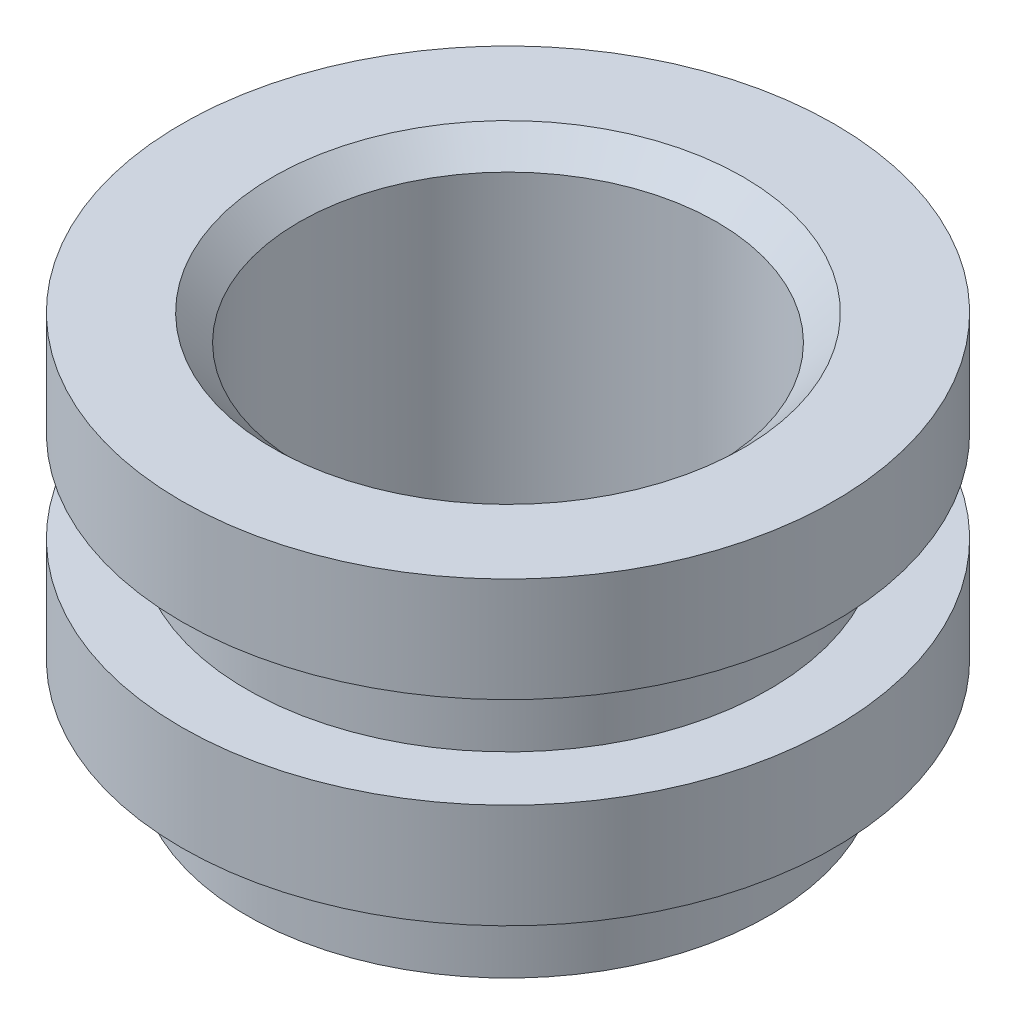
ISO-10303-21;
HEADER;
FILE_DESCRIPTION(('STEP AP214'),'2;1');
FILE_NAME('part.step','',(''),(''),'','','');
FILE_SCHEMA(('AUTOMOTIVE_DESIGN { 1 0 10303 214 1 1 1 1 }'));
ENDSEC;
DATA;
#1=APPLICATION_CONTEXT('core data for automotive mechanical design processes');
#2=APPLICATION_PROTOCOL_DEFINITION('international standard','automotive_design',2000,#1);
#3=PRODUCT_CONTEXT('',#1,'mechanical');
#4=PRODUCT('Part','Part','',(#3));
#5=PRODUCT_RELATED_PRODUCT_CATEGORY('part','',(#4));
#6=PRODUCT_DEFINITION_FORMATION('','',#4);
#7=PRODUCT_DEFINITION_CONTEXT('part definition',#1,'design');
#8=PRODUCT_DEFINITION('design','',#6,#7);
#9=PRODUCT_DEFINITION_SHAPE('','',#8);
#10=(LENGTH_UNIT() NAMED_UNIT(*) SI_UNIT(.MILLI.,.METRE.));
#11=(NAMED_UNIT(*) PLANE_ANGLE_UNIT() SI_UNIT($,.RADIAN.));
#12=(NAMED_UNIT(*) SI_UNIT($,.STERADIAN.) SOLID_ANGLE_UNIT());
#13=UNCERTAINTY_MEASURE_WITH_UNIT(LENGTH_MEASURE(1.E-05),#10,'distance_accuracy_value','');
#14=(GEOMETRIC_REPRESENTATION_CONTEXT(3) GLOBAL_UNCERTAINTY_ASSIGNED_CONTEXT((#13)) GLOBAL_UNIT_ASSIGNED_CONTEXT((#10,
#11,#12)) REPRESENTATION_CONTEXT('',''));
#15=CARTESIAN_POINT('',(0.,0.,0.));
#16=DIRECTION('',(0.,0.,1.));
#17=DIRECTION('',(1.,0.,0.));
#18=AXIS2_PLACEMENT_3D('',#15,#16,#17);
#19=CARTESIAN_POINT('',(-1.,0.20844480004597,0.));
#20=DIRECTION('',(0.,-1.,0.));
#21=DIRECTION('',(0.,0.,-1.));
#22=AXIS2_PLACEMENT_3D('',#19,#20,#21);
#23=PLANE('',#22);
#24=CARTESIAN_POINT('',(0.,0.20844480004597,0.));
#25=DIRECTION('',(0.,-1.,0.));
#26=DIRECTION('',(0.,0.,-1.));
#27=AXIS2_PLACEMENT_3D('',#24,#25,#26);
#28=CIRCLE('',#27,1.25);
#29=CARTESIAN_POINT('',(0.,0.20844480004597,-1.25));
#30=VERTEX_POINT('',#29);
#31=EDGE_CURVE('E55',#30,#30,#28,.T.);
#32=ORIENTED_EDGE('',*,*,#31,.F.);
#33=EDGE_LOOP('',(#32));
#34=FACE_BOUND('',#33,.T.);
#35=CARTESIAN_POINT('',(0.,0.20844480004597,0.));
#36=DIRECTION('',(0.,-1.,0.));
#37=DIRECTION('',(0.,0.,-1.));
#38=AXIS2_PLACEMENT_3D('',#35,#36,#37);
#39=CIRCLE('',#38,1.);
#40=CARTESIAN_POINT('',(0.,0.20844480004597,-1.));
#41=VERTEX_POINT('',#40);
#42=EDGE_CURVE('E76',#41,#41,#39,.T.);
#43=ORIENTED_EDGE('',*,*,#42,.T.);
#44=EDGE_LOOP('',(#43));
#45=FACE_BOUND('',#44,.T.);
#46=ADVANCED_FACE('F35',(#34,#45),#23,.F.);
#47=CARTESIAN_POINT('',(0.,-2.60469314079422,0.));
#48=DIRECTION('',(0.,-1.,0.));
#49=DIRECTION('',(0.,0.,-1.));
#50=AXIS2_PLACEMENT_3D('',#47,#48,#49);
#51=CYLINDRICAL_SURFACE('',#50,1.25);
#52=CARTESIAN_POINT('',(0.,-0.19155519995403,0.));
#53=DIRECTION('',(0.,-1.,0.));
#54=DIRECTION('',(0.,0.,-1.));
#55=AXIS2_PLACEMENT_3D('',#52,#53,#54);
#56=CIRCLE('',#55,1.25);
#57=CARTESIAN_POINT('',(0.,-0.19155519995403,-1.25));
#58=VERTEX_POINT('',#57);
#59=EDGE_CURVE('E58',#58,#58,#56,.T.);
#60=ORIENTED_EDGE('',*,*,#59,.F.);
#61=EDGE_LOOP('',(#60));
#62=FACE_BOUND('',#61,.T.);
#63=ORIENTED_EDGE('',*,*,#31,.T.);
#64=EDGE_LOOP('',(#63));
#65=FACE_BOUND('',#64,.T.);
#66=ADVANCED_FACE('F111',(#62,#65),#51,.T.);
#67=CARTESIAN_POINT('',(-1.25,-0.19155519995403,0.));
#68=DIRECTION('',(0.,1.,0.));
#69=DIRECTION('',(0.,0.,1.));
#70=AXIS2_PLACEMENT_3D('',#67,#68,#69);
#71=PLANE('',#70);
#72=CARTESIAN_POINT('',(0.,-0.19155519995403,0.));
#73=DIRECTION('',(0.,-1.,0.));
#74=DIRECTION('',(0.,0.,-1.));
#75=AXIS2_PLACEMENT_3D('',#72,#73,#74);
#76=CIRCLE('',#75,1.);
#77=CARTESIAN_POINT('',(0.,-0.19155519995403,-1.));
#78=VERTEX_POINT('',#77);
#79=EDGE_CURVE('E61',#78,#78,#76,.T.);
#80=ORIENTED_EDGE('',*,*,#79,.F.);
#81=EDGE_LOOP('',(#80));
#82=FACE_BOUND('',#81,.T.);
#83=ORIENTED_EDGE('',*,*,#59,.T.);
#84=EDGE_LOOP('',(#83));
#85=FACE_BOUND('',#84,.T.);
#86=ADVANCED_FACE('F117',(#82,#85),#71,.F.);
#87=CARTESIAN_POINT('',(0.,-2.60469314079422,0.));
#88=DIRECTION('',(0.,-1.,0.));
#89=DIRECTION('',(0.,0.,-1.));
#90=AXIS2_PLACEMENT_3D('',#87,#88,#89);
#91=CYLINDRICAL_SURFACE('',#90,1.);
#92=CARTESIAN_POINT('',(0.,-0.54155519995403,0.));
#93=DIRECTION('',(0.,-1.,0.));
#94=DIRECTION('',(0.,0.,-1.));
#95=AXIS2_PLACEMENT_3D('',#92,#93,#94);
#96=CIRCLE('',#95,1.);
#97=CARTESIAN_POINT('',(0.,-0.54155519995403,-1.));
#98=VERTEX_POINT('',#97);
#99=EDGE_CURVE('E64',#98,#98,#96,.T.);
#100=ORIENTED_EDGE('',*,*,#99,.F.);
#101=EDGE_LOOP('',(#100));
#102=FACE_BOUND('',#101,.T.);
#103=ORIENTED_EDGE('',*,*,#79,.T.);
#104=EDGE_LOOP('',(#103));
#105=FACE_BOUND('',#104,.T.);
#106=ADVANCED_FACE('F160',(#102,#105),#91,.T.);
#107=CARTESIAN_POINT('',(-0.8,-0.54155519995403,0.));
#108=DIRECTION('',(0.,1.,0.));
#109=DIRECTION('',(0.,0.,1.));
#110=AXIS2_PLACEMENT_3D('',#107,#108,#109);
#111=PLANE('',#110);
#112=CARTESIAN_POINT('',(0.,-0.54155519995403,0.));
#113=DIRECTION('',(0.,1.,0.));
#114=DIRECTION('',(0.,0.,1.));
#115=AXIS2_PLACEMENT_3D('',#112,#113,#114);
#116=CIRCLE('',#115,0.9);
#117=CARTESIAN_POINT('',(0.,-0.54155519995403,0.9));
#118=VERTEX_POINT('',#117);
#119=EDGE_CURVE('E42',#118,#118,#116,.T.);
#120=ORIENTED_EDGE('',*,*,#119,.T.);
#121=EDGE_LOOP('',(#120));
#122=FACE_BOUND('',#121,.T.);
#123=ORIENTED_EDGE('',*,*,#99,.T.);
#124=EDGE_LOOP('',(#123));
#125=FACE_BOUND('',#124,.T.);
#126=ADVANCED_FACE('F107',(#122,#125),#111,.F.);
#127=CARTESIAN_POINT('',(0.,-2.60469314079422,0.));
#128=DIRECTION('',(0.,-1.,0.));
#129=DIRECTION('',(0.,0.,-1.));
#130=AXIS2_PLACEMENT_3D('',#127,#128,#129);
#131=CYLINDRICAL_SURFACE('',#130,0.8);
#132=CARTESIAN_POINT('',(0.,-0.44155519995403,0.));
#133=DIRECTION('',(0.,1.,0.));
#134=DIRECTION('',(0.,0.,1.));
#135=AXIS2_PLACEMENT_3D('',#132,#133,#134);
#136=CIRCLE('',#135,0.8);
#137=CARTESIAN_POINT('',(0.,-0.44155519995403,0.8));
#138=VERTEX_POINT('',#137);
#139=EDGE_CURVE('E46',#138,#138,#136,.F.);
#140=ORIENTED_EDGE('',*,*,#139,.T.);
#141=EDGE_LOOP('',(#140));
#142=FACE_BOUND('',#141,.T.);
#143=CARTESIAN_POINT('',(0.,0.858444800045969,0.));
#144=DIRECTION('',(0.,-1.,0.));
#145=DIRECTION('',(0.,0.,-1.));
#146=AXIS2_PLACEMENT_3D('',#143,#144,#145);
#147=CIRCLE('',#146,0.8);
#148=CARTESIAN_POINT('',(0.,0.858444800045969,-0.8));
#149=VERTEX_POINT('',#148);
#150=EDGE_CURVE('E50',#149,#149,#147,.F.);
#151=ORIENTED_EDGE('',*,*,#150,.T.);
#152=EDGE_LOOP('',(#151));
#153=FACE_BOUND('',#152,.T.);
#154=ADVANCED_FACE('F102',(#142,#153),#131,.F.);
#155=CARTESIAN_POINT('',(-0.8,0.95844480004597,0.));
#156=DIRECTION('',(0.,-1.,0.));
#157=DIRECTION('',(0.,0.,-1.));
#158=AXIS2_PLACEMENT_3D('',#155,#156,#157);
#159=PLANE('',#158);
#160=CARTESIAN_POINT('',(0.,0.95844480004597,0.));
#161=DIRECTION('',(0.,-1.,0.));
#162=DIRECTION('',(0.,0.,-1.));
#163=AXIS2_PLACEMENT_3D('',#160,#161,#162);
#164=CIRCLE('',#163,0.9);
#165=CARTESIAN_POINT('',(0.,0.95844480004597,-0.9));
#166=VERTEX_POINT('',#165);
#167=EDGE_CURVE('E10',#166,#166,#164,.T.);
#168=ORIENTED_EDGE('',*,*,#167,.T.);
#169=EDGE_LOOP('',(#168));
#170=FACE_BOUND('',#169,.T.);
#171=CARTESIAN_POINT('',(0.,0.95844480004597,0.));
#172=DIRECTION('',(0.,-1.,0.));
#173=DIRECTION('',(0.,0.,-1.));
#174=AXIS2_PLACEMENT_3D('',#171,#172,#173);
#175=CIRCLE('',#174,1.25);
#176=CARTESIAN_POINT('',(0.,0.95844480004597,-1.25));
#177=VERTEX_POINT('',#176);
#178=EDGE_CURVE('E67',#177,#177,#175,.T.);
#179=ORIENTED_EDGE('',*,*,#178,.F.);
#180=EDGE_LOOP('',(#179));
#181=FACE_BOUND('',#180,.T.);
#182=ADVANCED_FACE('F97',(#170,#181),#159,.F.);
#183=CARTESIAN_POINT('',(0.,-2.60469314079422,0.));
#184=DIRECTION('',(0.,-1.,0.));
#185=DIRECTION('',(0.,0.,-1.));
#186=AXIS2_PLACEMENT_3D('',#183,#184,#185);
#187=CYLINDRICAL_SURFACE('',#186,1.25);
#188=CARTESIAN_POINT('',(0.,0.55844480004597,0.));
#189=DIRECTION('',(0.,-1.,0.));
#190=DIRECTION('',(0.,0.,-1.));
#191=AXIS2_PLACEMENT_3D('',#188,#189,#190);
#192=CIRCLE('',#191,1.25);
#193=CARTESIAN_POINT('',(0.,0.55844480004597,-1.25));
#194=VERTEX_POINT('',#193);
#195=EDGE_CURVE('E70',#194,#194,#192,.T.);
#196=ORIENTED_EDGE('',*,*,#195,.F.);
#197=EDGE_LOOP('',(#196));
#198=FACE_BOUND('',#197,.T.);
#199=ORIENTED_EDGE('',*,*,#178,.T.);
#200=EDGE_LOOP('',(#199));
#201=FACE_BOUND('',#200,.T.);
#202=ADVANCED_FACE('F91',(#198,#201),#187,.T.);
#203=CARTESIAN_POINT('',(-1.25,0.55844480004597,0.));
#204=DIRECTION('',(0.,1.,0.));
#205=DIRECTION('',(0.,0.,1.));
#206=AXIS2_PLACEMENT_3D('',#203,#204,#205);
#207=PLANE('',#206);
#208=CARTESIAN_POINT('',(0.,0.55844480004597,0.));
#209=DIRECTION('',(0.,-1.,0.));
#210=DIRECTION('',(0.,0.,-1.));
#211=AXIS2_PLACEMENT_3D('',#208,#209,#210);
#212=CIRCLE('',#211,1.);
#213=CARTESIAN_POINT('',(0.,0.55844480004597,-1.));
#214=VERTEX_POINT('',#213);
#215=EDGE_CURVE('E73',#214,#214,#212,.T.);
#216=ORIENTED_EDGE('',*,*,#215,.F.);
#217=EDGE_LOOP('',(#216));
#218=FACE_BOUND('',#217,.T.);
#219=ORIENTED_EDGE('',*,*,#195,.T.);
#220=EDGE_LOOP('',(#219));
#221=FACE_BOUND('',#220,.T.);
#222=ADVANCED_FACE('F85',(#218,#221),#207,.F.);
#223=CARTESIAN_POINT('',(0.,-2.60469314079422,0.));
#224=DIRECTION('',(0.,-1.,0.));
#225=DIRECTION('',(0.,0.,-1.));
#226=AXIS2_PLACEMENT_3D('',#223,#224,#225);
#227=CYLINDRICAL_SURFACE('',#226,1.);
#228=ORIENTED_EDGE('',*,*,#42,.F.);
#229=EDGE_LOOP('',(#228));
#230=FACE_BOUND('',#229,.T.);
#231=ORIENTED_EDGE('',*,*,#215,.T.);
#232=EDGE_LOOP('',(#231));
#233=FACE_BOUND('',#232,.T.);
#234=ADVANCED_FACE('F81',(#230,#233),#227,.T.);
#235=CARTESIAN_POINT('',(0.,-0.44155519995403,0.));
#236=DIRECTION('',(0.,-1.,0.));
#237=DIRECTION('',(0.,0.,-1.));
#238=AXIS2_PLACEMENT_3D('',#235,#236,#237);
#239=CONICAL_SURFACE('',#238,0.8,0.785398163397449);
#240=ORIENTED_EDGE('',*,*,#119,.F.);
#241=EDGE_LOOP('',(#240));
#242=FACE_BOUND('',#241,.T.);
#243=ORIENTED_EDGE('',*,*,#139,.F.);
#244=EDGE_LOOP('',(#243));
#245=FACE_BOUND('',#244,.T.);
#246=ADVANCED_FACE('F84',(#242,#245),#239,.F.);
#247=CARTESIAN_POINT('',(0.,0.95844480004597,0.));
#248=DIRECTION('',(0.,1.,0.));
#249=DIRECTION('',(0.,0.,1.));
#250=AXIS2_PLACEMENT_3D('',#247,#248,#249);
#251=CONICAL_SURFACE('',#250,0.9,0.785398163397448);
#252=ORIENTED_EDGE('',*,*,#150,.F.);
#253=EDGE_LOOP('',(#252));
#254=FACE_BOUND('',#253,.T.);
#255=ORIENTED_EDGE('',*,*,#167,.F.);
#256=EDGE_LOOP('',(#255));
#257=FACE_BOUND('',#256,.T.);
#258=ADVANCED_FACE('F37',(#254,#257),#251,.F.);
#259=CLOSED_SHELL('',(#46,#66,#86,#106,#126,#154,#182,#202,#222,#234,#246,#258));
#260=MANIFOLD_SOLID_BREP('B2',#259);
#261=ADVANCED_BREP_SHAPE_REPRESENTATION('',(#18,#260),#14);
#262=SHAPE_DEFINITION_REPRESENTATION(#9,#261);
ENDSEC;
END-ISO-10303-21;
